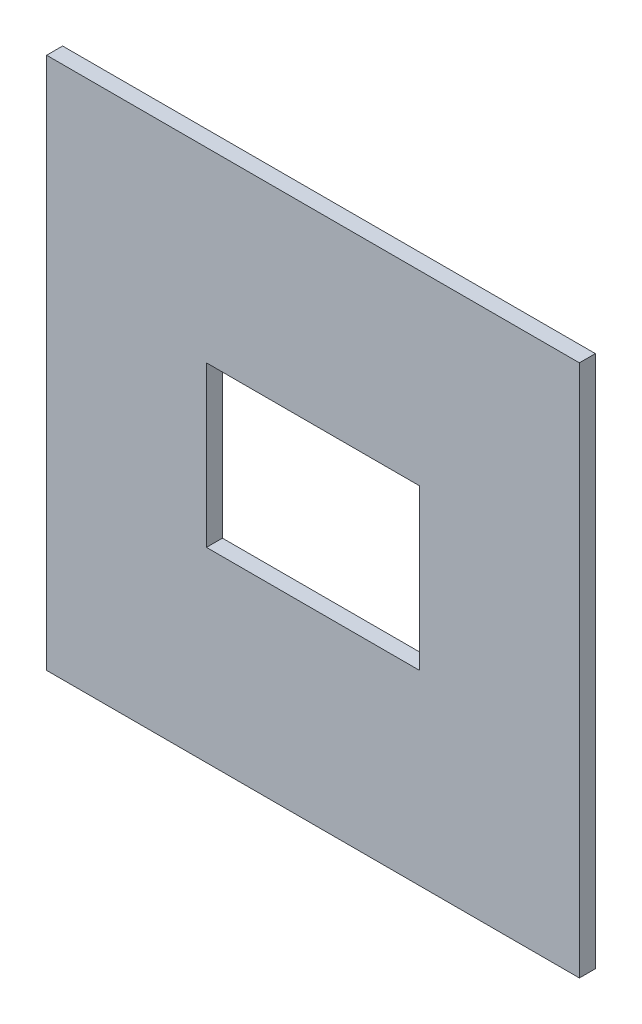
ISO-10303-21;
HEADER;
FILE_DESCRIPTION(('STEP AP214'),'2;1');
FILE_NAME('part.step','',(''),(''),'','','');
FILE_SCHEMA(('AUTOMOTIVE_DESIGN { 1 0 10303 214 1 1 1 1 }'));
ENDSEC;
DATA;
#1=APPLICATION_CONTEXT('core data for automotive mechanical design processes');
#2=APPLICATION_PROTOCOL_DEFINITION('international standard','automotive_design',2000,#1);
#3=PRODUCT_CONTEXT('',#1,'mechanical');
#4=PRODUCT('Part','Part','',(#3));
#5=PRODUCT_RELATED_PRODUCT_CATEGORY('part','',(#4));
#6=PRODUCT_DEFINITION_FORMATION('','',#4);
#7=PRODUCT_DEFINITION_CONTEXT('part definition',#1,'design');
#8=PRODUCT_DEFINITION('design','',#6,#7);
#9=PRODUCT_DEFINITION_SHAPE('','',#8);
#10=(LENGTH_UNIT() NAMED_UNIT(*) SI_UNIT(.MILLI.,.METRE.));
#11=(NAMED_UNIT(*) PLANE_ANGLE_UNIT() SI_UNIT($,.RADIAN.));
#12=(NAMED_UNIT(*) SI_UNIT($,.STERADIAN.) SOLID_ANGLE_UNIT());
#13=UNCERTAINTY_MEASURE_WITH_UNIT(LENGTH_MEASURE(1.E-05),#10,'distance_accuracy_value','');
#14=(GEOMETRIC_REPRESENTATION_CONTEXT(3) GLOBAL_UNCERTAINTY_ASSIGNED_CONTEXT((#13)) GLOBAL_UNIT_ASSIGNED_CONTEXT((#10,
#11,#12)) REPRESENTATION_CONTEXT('',''));
#15=CARTESIAN_POINT('',(0.,0.,0.));
#16=DIRECTION('',(0.,0.,1.));
#17=DIRECTION('',(1.,0.,0.));
#18=AXIS2_PLACEMENT_3D('',#15,#16,#17);
#19=CARTESIAN_POINT('',(250.,250.,15.));
#20=DIRECTION('',(-1.,0.,0.));
#21=DIRECTION('',(0.,-1.,0.));
#22=AXIS2_PLACEMENT_3D('',#19,#20,#21);
#23=PLANE('',#22);
#24=DIRECTION('',(0.,1.,0.));
#25=VECTOR('',#24,1.);
#26=CARTESIAN_POINT('',(250.,250.,0.));
#27=LINE('',#26,#25);
#28=CARTESIAN_POINT('',(250.,-250.,0.));
#29=VERTEX_POINT('',#28);
#30=CARTESIAN_POINT('',(250.,250.,0.));
#31=VERTEX_POINT('',#30);
#32=EDGE_CURVE('E136',#29,#31,#27,.T.);
#33=ORIENTED_EDGE('',*,*,#32,.T.);
#34=DIRECTION('',(0.,0.,-1.));
#35=VECTOR('',#34,1.);
#36=CARTESIAN_POINT('',(250.,250.,15.));
#37=LINE('',#36,#35);
#38=CARTESIAN_POINT('',(250.,250.,15.));
#39=VERTEX_POINT('',#38);
#40=EDGE_CURVE('E11',#39,#31,#37,.T.);
#41=ORIENTED_EDGE('',*,*,#40,.F.);
#42=DIRECTION('',(0.,1.,0.));
#43=VECTOR('',#42,1.);
#44=CARTESIAN_POINT('',(250.,250.,15.));
#45=LINE('',#44,#43);
#46=CARTESIAN_POINT('',(250.,-250.,15.));
#47=VERTEX_POINT('',#46);
#48=EDGE_CURVE('E140',#47,#39,#45,.T.);
#49=ORIENTED_EDGE('',*,*,#48,.F.);
#50=DIRECTION('',(0.,0.,-1.));
#51=VECTOR('',#50,1.);
#52=CARTESIAN_POINT('',(250.,-250.,15.));
#53=LINE('',#52,#51);
#54=EDGE_CURVE('E150',#47,#29,#53,.T.);
#55=ORIENTED_EDGE('',*,*,#54,.T.);
#56=EDGE_LOOP('',(#33,#41,#49,#55));
#57=FACE_BOUND('',#56,.T.);
#58=ADVANCED_FACE('F39',(#57),#23,.F.);
#59=CARTESIAN_POINT('',(-250.,250.,15.));
#60=DIRECTION('',(0.,-1.,0.));
#61=DIRECTION('',(0.,0.,-1.));
#62=AXIS2_PLACEMENT_3D('',#59,#60,#61);
#63=PLANE('',#62);
#64=DIRECTION('',(-1.,0.,0.));
#65=VECTOR('',#64,1.);
#66=CARTESIAN_POINT('',(-250.,250.,0.));
#67=LINE('',#66,#65);
#68=CARTESIAN_POINT('',(-250.,250.,0.));
#69=VERTEX_POINT('',#68);
#70=EDGE_CURVE('E153',#31,#69,#67,.T.);
#71=ORIENTED_EDGE('',*,*,#70,.T.);
#72=DIRECTION('',(0.,0.,-1.));
#73=VECTOR('',#72,1.);
#74=CARTESIAN_POINT('',(-250.,250.,15.));
#75=LINE('',#74,#73);
#76=CARTESIAN_POINT('',(-250.,250.,15.));
#77=VERTEX_POINT('',#76);
#78=EDGE_CURVE('E46',#77,#69,#75,.T.);
#79=ORIENTED_EDGE('',*,*,#78,.F.);
#80=DIRECTION('',(-1.,0.,0.));
#81=VECTOR('',#80,1.);
#82=CARTESIAN_POINT('',(-250.,250.,15.));
#83=LINE('',#82,#81);
#84=EDGE_CURVE('E143',#39,#77,#83,.T.);
#85=ORIENTED_EDGE('',*,*,#84,.F.);
#86=ORIENTED_EDGE('',*,*,#40,.T.);
#87=EDGE_LOOP('',(#71,#79,#85,#86));
#88=FACE_BOUND('',#87,.T.);
#89=ADVANCED_FACE('F181',(#88),#63,.F.);
#90=CARTESIAN_POINT('',(-250.,250.,15.));
#91=DIRECTION('',(1.,0.,0.));
#92=DIRECTION('',(0.,1.,0.));
#93=AXIS2_PLACEMENT_3D('',#90,#91,#92);
#94=PLANE('',#93);
#95=DIRECTION('',(0.,-1.,0.));
#96=VECTOR('',#95,1.);
#97=CARTESIAN_POINT('',(-250.,250.,0.));
#98=LINE('',#97,#96);
#99=CARTESIAN_POINT('',(-250.,-250.,0.));
#100=VERTEX_POINT('',#99);
#101=EDGE_CURVE('E155',#69,#100,#98,.T.);
#102=ORIENTED_EDGE('',*,*,#101,.T.);
#103=DIRECTION('',(0.,0.,-1.));
#104=VECTOR('',#103,1.);
#105=CARTESIAN_POINT('',(-250.,-250.,15.));
#106=LINE('',#105,#104);
#107=CARTESIAN_POINT('',(-250.,-250.,15.));
#108=VERTEX_POINT('',#107);
#109=EDGE_CURVE('E160',#108,#100,#106,.T.);
#110=ORIENTED_EDGE('',*,*,#109,.F.);
#111=DIRECTION('',(0.,-1.,0.));
#112=VECTOR('',#111,1.);
#113=CARTESIAN_POINT('',(-250.,250.,15.));
#114=LINE('',#113,#112);
#115=EDGE_CURVE('E146',#77,#108,#114,.T.);
#116=ORIENTED_EDGE('',*,*,#115,.F.);
#117=ORIENTED_EDGE('',*,*,#78,.T.);
#118=EDGE_LOOP('',(#102,#110,#116,#117));
#119=FACE_BOUND('',#118,.T.);
#120=ADVANCED_FACE('F167',(#119),#94,.F.);
#121=CARTESIAN_POINT('',(-250.,-250.,15.));
#122=DIRECTION('',(0.,1.,0.));
#123=DIRECTION('',(0.,0.,1.));
#124=AXIS2_PLACEMENT_3D('',#121,#122,#123);
#125=PLANE('',#124);
#126=DIRECTION('',(1.,0.,0.));
#127=VECTOR('',#126,1.);
#128=CARTESIAN_POINT('',(-250.,-250.,0.));
#129=LINE('',#128,#127);
#130=EDGE_CURVE('E144',#100,#29,#129,.T.);
#131=ORIENTED_EDGE('',*,*,#130,.T.);
#132=ORIENTED_EDGE('',*,*,#54,.F.);
#133=DIRECTION('',(1.,0.,0.));
#134=VECTOR('',#133,1.);
#135=CARTESIAN_POINT('',(-250.,-250.,15.));
#136=LINE('',#135,#134);
#137=EDGE_CURVE('E148',#108,#47,#136,.T.);
#138=ORIENTED_EDGE('',*,*,#137,.F.);
#139=ORIENTED_EDGE('',*,*,#109,.T.);
#140=EDGE_LOOP('',(#131,#132,#138,#139));
#141=FACE_BOUND('',#140,.T.);
#142=ADVANCED_FACE('F174',(#141),#125,.F.);
#143=CARTESIAN_POINT('',(0.,0.,15.));
#144=DIRECTION('',(0.,0.,1.));
#145=DIRECTION('',(1.,0.,0.));
#146=AXIS2_PLACEMENT_3D('',#143,#144,#145);
#147=PLANE('',#146);
#148=DIRECTION('',(0.,1.,0.));
#149=VECTOR('',#148,1.);
#150=CARTESIAN_POINT('',(100.,75.,15.));
#151=LINE('',#150,#149);
#152=CARTESIAN_POINT('',(100.,-75.,15.));
#153=VERTEX_POINT('',#152);
#154=CARTESIAN_POINT('',(100.,75.,15.));
#155=VERTEX_POINT('',#154);
#156=EDGE_CURVE('E53',#153,#155,#151,.T.);
#157=ORIENTED_EDGE('',*,*,#156,.F.);
#158=DIRECTION('',(1.,0.,0.));
#159=VECTOR('',#158,1.);
#160=CARTESIAN_POINT('',(-100.,-75.,15.));
#161=LINE('',#160,#159);
#162=CARTESIAN_POINT('',(-100.,-75.,15.));
#163=VERTEX_POINT('',#162);
#164=EDGE_CURVE('E121',#163,#153,#161,.T.);
#165=ORIENTED_EDGE('',*,*,#164,.F.);
#166=DIRECTION('',(0.,-1.,0.));
#167=VECTOR('',#166,1.);
#168=CARTESIAN_POINT('',(-100.,75.,15.));
#169=LINE('',#168,#167);
#170=CARTESIAN_POINT('',(-100.,75.,15.));
#171=VERTEX_POINT('',#170);
#172=EDGE_CURVE('E124',#171,#163,#169,.T.);
#173=ORIENTED_EDGE('',*,*,#172,.F.);
#174=DIRECTION('',(-1.,0.,0.));
#175=VECTOR('',#174,1.);
#176=CARTESIAN_POINT('',(-100.,75.,15.));
#177=LINE('',#176,#175);
#178=EDGE_CURVE('E130',#155,#171,#177,.T.);
#179=ORIENTED_EDGE('',*,*,#178,.F.);
#180=EDGE_LOOP('',(#157,#165,#173,#179));
#181=FACE_BOUND('',#180,.T.);
#182=ORIENTED_EDGE('',*,*,#48,.T.);
#183=ORIENTED_EDGE('',*,*,#84,.T.);
#184=ORIENTED_EDGE('',*,*,#115,.T.);
#185=ORIENTED_EDGE('',*,*,#137,.T.);
#186=EDGE_LOOP('',(#182,#183,#184,#185));
#187=FACE_BOUND('',#186,.T.);
#188=ADVANCED_FACE('F180',(#181,#187),#147,.T.);
#189=CARTESIAN_POINT('',(0.,0.,0.));
#190=DIRECTION('',(0.,0.,1.));
#191=DIRECTION('',(1.,0.,0.));
#192=AXIS2_PLACEMENT_3D('',#189,#190,#191);
#193=PLANE('',#192);
#194=DIRECTION('',(1.,0.,0.));
#195=VECTOR('',#194,1.);
#196=CARTESIAN_POINT('',(-100.,-75.,0.));
#197=LINE('',#196,#195);
#198=CARTESIAN_POINT('',(-100.,-75.,0.));
#199=VERTEX_POINT('',#198);
#200=CARTESIAN_POINT('',(100.,-75.,0.));
#201=VERTEX_POINT('',#200);
#202=EDGE_CURVE('E111',#199,#201,#197,.T.);
#203=ORIENTED_EDGE('',*,*,#202,.T.);
#204=DIRECTION('',(0.,1.,0.));
#205=VECTOR('',#204,1.);
#206=CARTESIAN_POINT('',(100.,75.,0.));
#207=LINE('',#206,#205);
#208=CARTESIAN_POINT('',(100.,75.,0.));
#209=VERTEX_POINT('',#208);
#210=EDGE_CURVE('E105',#201,#209,#207,.T.);
#211=ORIENTED_EDGE('',*,*,#210,.T.);
#212=DIRECTION('',(-1.,0.,0.));
#213=VECTOR('',#212,1.);
#214=CARTESIAN_POINT('',(-100.,75.,0.));
#215=LINE('',#214,#213);
#216=CARTESIAN_POINT('',(-100.,75.,0.));
#217=VERTEX_POINT('',#216);
#218=EDGE_CURVE('E114',#209,#217,#215,.T.);
#219=ORIENTED_EDGE('',*,*,#218,.T.);
#220=DIRECTION('',(0.,-1.,0.));
#221=VECTOR('',#220,1.);
#222=CARTESIAN_POINT('',(-100.,75.,0.));
#223=LINE('',#222,#221);
#224=EDGE_CURVE('E61',#217,#199,#223,.T.);
#225=ORIENTED_EDGE('',*,*,#224,.T.);
#226=EDGE_LOOP('',(#203,#211,#219,#225));
#227=FACE_BOUND('',#226,.T.);
#228=ORIENTED_EDGE('',*,*,#32,.F.);
#229=ORIENTED_EDGE('',*,*,#130,.F.);
#230=ORIENTED_EDGE('',*,*,#101,.F.);
#231=ORIENTED_EDGE('',*,*,#70,.F.);
#232=EDGE_LOOP('',(#228,#229,#230,#231));
#233=FACE_BOUND('',#232,.T.);
#234=ADVANCED_FACE('F118',(#227,#233),#193,.F.);
#235=CARTESIAN_POINT('',(100.,75.,0.));
#236=DIRECTION('',(1.,0.,0.));
#237=DIRECTION('',(0.,0.,-1.));
#238=AXIS2_PLACEMENT_3D('',#235,#236,#237);
#239=PLANE('',#238);
#240=ORIENTED_EDGE('',*,*,#156,.T.);
#241=DIRECTION('',(0.,0.,1.));
#242=VECTOR('',#241,1.);
#243=CARTESIAN_POINT('',(100.,75.,0.));
#244=LINE('',#243,#242);
#245=EDGE_CURVE('E101',#209,#155,#244,.T.);
#246=ORIENTED_EDGE('',*,*,#245,.F.);
#247=ORIENTED_EDGE('',*,*,#210,.F.);
#248=DIRECTION('',(0.,0.,1.));
#249=VECTOR('',#248,1.);
#250=CARTESIAN_POINT('',(100.,-75.,0.));
#251=LINE('',#250,#249);
#252=EDGE_CURVE('E134',#201,#153,#251,.T.);
#253=ORIENTED_EDGE('',*,*,#252,.T.);
#254=EDGE_LOOP('',(#240,#246,#247,#253));
#255=FACE_BOUND('',#254,.T.);
#256=ADVANCED_FACE('F103',(#255),#239,.F.);
#257=CARTESIAN_POINT('',(-100.,-75.,0.));
#258=DIRECTION('',(0.,-1.,0.));
#259=DIRECTION('',(0.,0.,-1.));
#260=AXIS2_PLACEMENT_3D('',#257,#258,#259);
#261=PLANE('',#260);
#262=ORIENTED_EDGE('',*,*,#164,.T.);
#263=ORIENTED_EDGE('',*,*,#252,.F.);
#264=ORIENTED_EDGE('',*,*,#202,.F.);
#265=DIRECTION('',(0.,0.,1.));
#266=VECTOR('',#265,1.);
#267=CARTESIAN_POINT('',(-100.,-75.,0.));
#268=LINE('',#267,#266);
#269=EDGE_CURVE('E137',#199,#163,#268,.T.);
#270=ORIENTED_EDGE('',*,*,#269,.T.);
#271=EDGE_LOOP('',(#262,#263,#264,#270));
#272=FACE_BOUND('',#271,.T.);
#273=ADVANCED_FACE('F198',(#272),#261,.F.);
#274=CARTESIAN_POINT('',(-100.,75.,0.));
#275=DIRECTION('',(-1.,0.,0.));
#276=DIRECTION('',(0.,-1.,0.));
#277=AXIS2_PLACEMENT_3D('',#274,#275,#276);
#278=PLANE('',#277);
#279=ORIENTED_EDGE('',*,*,#172,.T.);
#280=ORIENTED_EDGE('',*,*,#269,.F.);
#281=ORIENTED_EDGE('',*,*,#224,.F.);
#282=DIRECTION('',(0.,0.,1.));
#283=VECTOR('',#282,1.);
#284=CARTESIAN_POINT('',(-100.,75.,0.));
#285=LINE('',#284,#283);
#286=EDGE_CURVE('E110',#217,#171,#285,.T.);
#287=ORIENTED_EDGE('',*,*,#286,.T.);
#288=EDGE_LOOP('',(#279,#280,#281,#287));
#289=FACE_BOUND('',#288,.T.);
#290=ADVANCED_FACE('F201',(#289),#278,.F.);
#291=CARTESIAN_POINT('',(-100.,75.,0.));
#292=DIRECTION('',(0.,1.,0.));
#293=DIRECTION('',(0.,0.,1.));
#294=AXIS2_PLACEMENT_3D('',#291,#292,#293);
#295=PLANE('',#294);
#296=ORIENTED_EDGE('',*,*,#178,.T.);
#297=ORIENTED_EDGE('',*,*,#286,.F.);
#298=ORIENTED_EDGE('',*,*,#218,.F.);
#299=ORIENTED_EDGE('',*,*,#245,.T.);
#300=EDGE_LOOP('',(#296,#297,#298,#299));
#301=FACE_BOUND('',#300,.T.);
#302=ADVANCED_FACE('F115',(#301),#295,.F.);
#303=CLOSED_SHELL('',(#58,#89,#120,#142,#188,#234,#256,#273,#290,#302));
#304=MANIFOLD_SOLID_BREP('B2',#303);
#305=ADVANCED_BREP_SHAPE_REPRESENTATION('',(#18,#304),#14);
#306=SHAPE_DEFINITION_REPRESENTATION(#9,#305);
ENDSEC;
END-ISO-10303-21;
